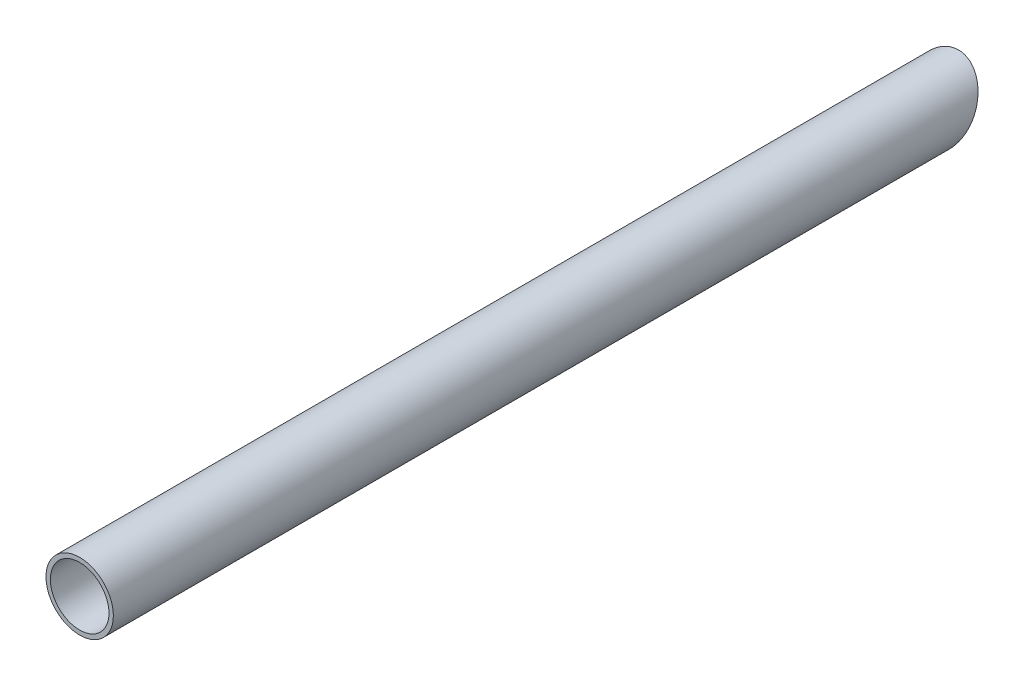
ISO-10303-21;
HEADER;
FILE_DESCRIPTION(('STEP AP214'),'2;1');
FILE_NAME('part.step','',(''),(''),'','','');
FILE_SCHEMA(('AUTOMOTIVE_DESIGN { 1 0 10303 214 1 1 1 1 }'));
ENDSEC;
DATA;
#1=APPLICATION_CONTEXT('core data for automotive mechanical design processes');
#2=APPLICATION_PROTOCOL_DEFINITION('international standard','automotive_design',2000,#1);
#3=PRODUCT_CONTEXT('',#1,'mechanical');
#4=PRODUCT('Part','Part','',(#3));
#5=PRODUCT_RELATED_PRODUCT_CATEGORY('part','',(#4));
#6=PRODUCT_DEFINITION_FORMATION('','',#4);
#7=PRODUCT_DEFINITION_CONTEXT('part definition',#1,'design');
#8=PRODUCT_DEFINITION('design','',#6,#7);
#9=PRODUCT_DEFINITION_SHAPE('','',#8);
#10=(LENGTH_UNIT() NAMED_UNIT(*) SI_UNIT(.MILLI.,.METRE.));
#11=(NAMED_UNIT(*) PLANE_ANGLE_UNIT() SI_UNIT($,.RADIAN.));
#12=(NAMED_UNIT(*) SI_UNIT($,.STERADIAN.) SOLID_ANGLE_UNIT());
#13=UNCERTAINTY_MEASURE_WITH_UNIT(LENGTH_MEASURE(1.E-05),#10,'distance_accuracy_value','');
#14=(GEOMETRIC_REPRESENTATION_CONTEXT(3) GLOBAL_UNCERTAINTY_ASSIGNED_CONTEXT((#13)) GLOBAL_UNIT_ASSIGNED_CONTEXT((#10,
#11,#12)) REPRESENTATION_CONTEXT('',''));
#15=CARTESIAN_POINT('',(0.,0.,0.));
#16=DIRECTION('',(0.,0.,1.));
#17=DIRECTION('',(1.,0.,0.));
#18=AXIS2_PLACEMENT_3D('',#15,#16,#17);
#19=CARTESIAN_POINT('',(0.,0.,150.));
#20=DIRECTION('',(0.,0.,1.));
#21=DIRECTION('',(1.,0.,0.));
#22=AXIS2_PLACEMENT_3D('',#19,#20,#21);
#23=PLANE('',#22);
#24=CARTESIAN_POINT('',(0.,0.,150.));
#25=DIRECTION('',(0.,0.,1.));
#26=DIRECTION('',(1.,0.,0.));
#27=AXIS2_PLACEMENT_3D('',#24,#25,#26);
#28=CIRCLE('',#27,11.5);
#29=CARTESIAN_POINT('',(11.5,0.,150.));
#30=VERTEX_POINT('',#29);
#31=EDGE_CURVE('E11',#30,#30,#28,.T.);
#32=ORIENTED_EDGE('',*,*,#31,.T.);
#33=EDGE_LOOP('',(#32));
#34=FACE_BOUND('',#33,.T.);
#35=CARTESIAN_POINT('',(0.,0.,150.));
#36=DIRECTION('',(0.,0.,1.));
#37=DIRECTION('',(1.,0.,0.));
#38=AXIS2_PLACEMENT_3D('',#35,#36,#37);
#39=CIRCLE('',#38,10.);
#40=CARTESIAN_POINT('',(10.,0.,150.));
#41=VERTEX_POINT('',#40);
#42=EDGE_CURVE('E58',#41,#41,#39,.T.);
#43=ORIENTED_EDGE('',*,*,#42,.F.);
#44=EDGE_LOOP('',(#43));
#45=FACE_BOUND('',#44,.T.);
#46=ADVANCED_FACE('F49',(#34,#45),#23,.T.);
#47=CARTESIAN_POINT('',(0.,0.,150.));
#48=DIRECTION('',(0.,0.,-1.));
#49=DIRECTION('',(-1.,0.,0.));
#50=AXIS2_PLACEMENT_3D('',#47,#48,#49);
#51=CYLINDRICAL_SURFACE('',#50,11.5);
#52=ORIENTED_EDGE('',*,*,#31,.F.);
#53=EDGE_LOOP('',(#52));
#54=FACE_BOUND('',#53,.T.);
#55=CARTESIAN_POINT('',(0.,0.,-143.360471904319));
#56=DIRECTION('',(0.,0.500000000000004,0.866025403784436));
#57=DIRECTION('',(0.,0.866025403784436,-0.500000000000004));
#58=AXIS2_PLACEMENT_3D('',#55,#56,#57);
#59=ELLIPSE('',#58,13.2790561913614,11.5);
#60=CARTESIAN_POINT('',(0.,11.5,-150.));
#61=VERTEX_POINT('',#60);
#62=EDGE_CURVE('E63',#61,#61,#59,.T.);
#63=ORIENTED_EDGE('',*,*,#62,.T.);
#64=EDGE_LOOP('',(#63));
#65=FACE_BOUND('',#64,.T.);
#66=ADVANCED_FACE('F51',(#54,#65),#51,.T.);
#67=CARTESIAN_POINT('',(0.,0.,150.));
#68=DIRECTION('',(0.,0.,-1.));
#69=DIRECTION('',(-1.,0.,0.));
#70=AXIS2_PLACEMENT_3D('',#67,#68,#69);
#71=CYLINDRICAL_SURFACE('',#70,10.);
#72=CARTESIAN_POINT('',(0.,0.,-143.360471904319));
#73=DIRECTION('',(0.,0.500000000000004,0.866025403784436));
#74=DIRECTION('',(0.,0.866025403784436,-0.500000000000004));
#75=AXIS2_PLACEMENT_3D('',#72,#73,#74);
#76=ELLIPSE('',#75,11.5470053837926,10.);
#77=CARTESIAN_POINT('',(0.,10.,-149.133974596216));
#78=VERTEX_POINT('',#77);
#79=EDGE_CURVE('E53',#78,#78,#76,.T.);
#80=ORIENTED_EDGE('',*,*,#79,.F.);
#81=EDGE_LOOP('',(#80));
#82=FACE_BOUND('',#81,.T.);
#83=ORIENTED_EDGE('',*,*,#42,.T.);
#84=EDGE_LOOP('',(#83));
#85=FACE_BOUND('',#84,.T.);
#86=ADVANCED_FACE('F77',(#82,#85),#71,.F.);
#87=CARTESIAN_POINT('',(-15.,11.5,-150.));
#88=DIRECTION('',(0.,0.500000000000004,0.866025403784436));
#89=DIRECTION('',(0.,-0.866025403784436,0.500000000000004));
#90=AXIS2_PLACEMENT_3D('',#87,#88,#89);
#91=PLANE('',#90);
#92=ORIENTED_EDGE('',*,*,#79,.T.);
#93=EDGE_LOOP('',(#92));
#94=FACE_BOUND('',#93,.T.);
#95=ORIENTED_EDGE('',*,*,#62,.F.);
#96=EDGE_LOOP('',(#95));
#97=FACE_BOUND('',#96,.T.);
#98=ADVANCED_FACE('F74',(#94,#97),#91,.F.);
#99=CLOSED_SHELL('',(#46,#66,#86,#98));
#100=MANIFOLD_SOLID_BREP('B2',#99);
#101=ADVANCED_BREP_SHAPE_REPRESENTATION('',(#18,#100),#14);
#102=SHAPE_DEFINITION_REPRESENTATION(#9,#101);
ENDSEC;
END-ISO-10303-21;
